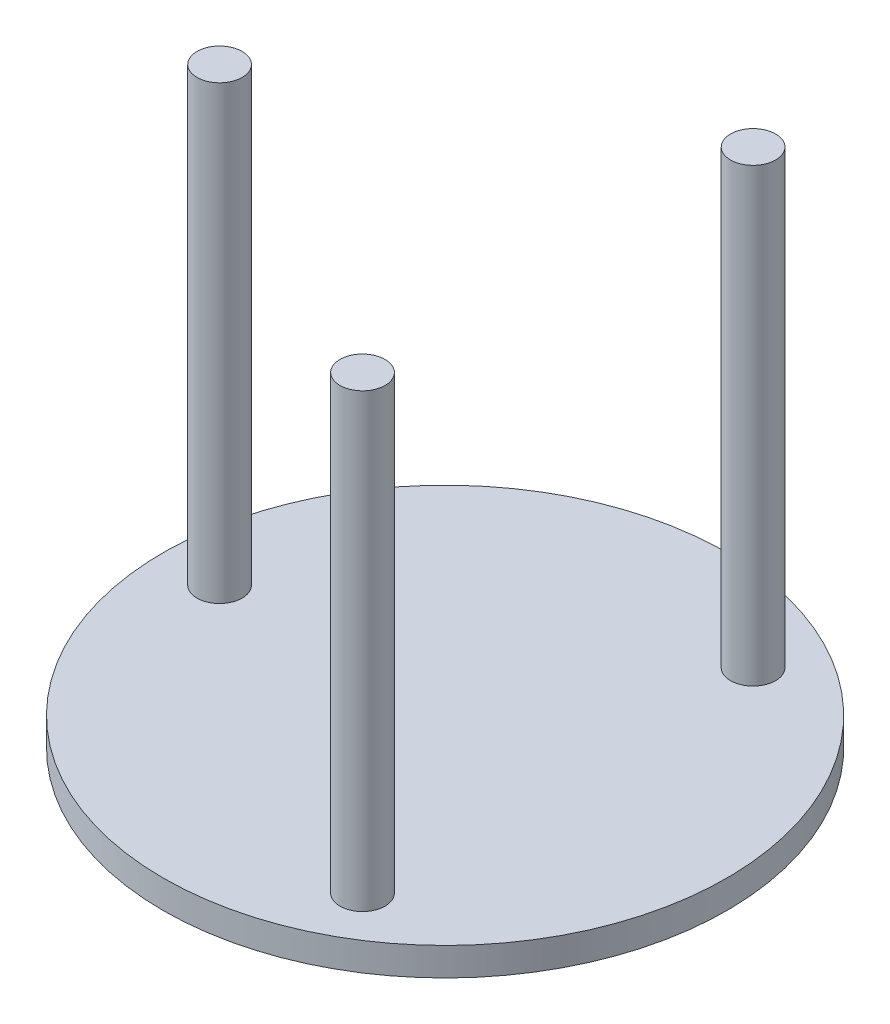
ISO-10303-21;
HEADER;
FILE_DESCRIPTION(('STEP AP214'),'2;1');
FILE_NAME('part.step','',(''),(''),'','','');
FILE_SCHEMA(('AUTOMOTIVE_DESIGN { 1 0 10303 214 1 1 1 1 }'));
ENDSEC;
DATA;
#1=APPLICATION_CONTEXT('core data for automotive mechanical design processes');
#2=APPLICATION_PROTOCOL_DEFINITION('international standard','automotive_design',2000,#1);
#3=PRODUCT_CONTEXT('',#1,'mechanical');
#4=PRODUCT('Part','Part','',(#3));
#5=PRODUCT_RELATED_PRODUCT_CATEGORY('part','',(#4));
#6=PRODUCT_DEFINITION_FORMATION('','',#4);
#7=PRODUCT_DEFINITION_CONTEXT('part definition',#1,'design');
#8=PRODUCT_DEFINITION('design','',#6,#7);
#9=PRODUCT_DEFINITION_SHAPE('','',#8);
#10=(LENGTH_UNIT() NAMED_UNIT(*) SI_UNIT(.MILLI.,.METRE.));
#11=(NAMED_UNIT(*) PLANE_ANGLE_UNIT() SI_UNIT($,.RADIAN.));
#12=(NAMED_UNIT(*) SI_UNIT($,.STERADIAN.) SOLID_ANGLE_UNIT());
#13=UNCERTAINTY_MEASURE_WITH_UNIT(LENGTH_MEASURE(1.E-05),#10,'distance_accuracy_value','');
#14=(GEOMETRIC_REPRESENTATION_CONTEXT(3) GLOBAL_UNCERTAINTY_ASSIGNED_CONTEXT((#13)) GLOBAL_UNIT_ASSIGNED_CONTEXT((#10,
#11,#12)) REPRESENTATION_CONTEXT('',''));
#15=CARTESIAN_POINT('',(0.,0.,0.));
#16=DIRECTION('',(0.,0.,1.));
#17=DIRECTION('',(1.,0.,0.));
#18=AXIS2_PLACEMENT_3D('',#15,#16,#17);
#19=CARTESIAN_POINT('',(0.,5.,0.));
#20=DIRECTION('',(0.,-1.,0.));
#21=DIRECTION('',(0.,0.,-1.));
#22=AXIS2_PLACEMENT_3D('',#19,#20,#21);
#23=CYLINDRICAL_SURFACE('',#22,50.);
#24=CARTESIAN_POINT('',(0.,5.,0.));
#25=DIRECTION('',(0.,1.,0.));
#26=DIRECTION('',(0.,0.,1.));
#27=AXIS2_PLACEMENT_3D('',#24,#25,#26);
#28=CIRCLE('',#27,50.);
#29=CARTESIAN_POINT('',(0.,5.,50.));
#30=VERTEX_POINT('',#29);
#31=EDGE_CURVE('E10',#30,#30,#28,.T.);
#32=ORIENTED_EDGE('',*,*,#31,.F.);
#33=EDGE_LOOP('',(#32));
#34=FACE_BOUND('',#33,.T.);
#35=CARTESIAN_POINT('',(0.,0.,0.));
#36=DIRECTION('',(0.,1.,0.));
#37=DIRECTION('',(0.,0.,1.));
#38=AXIS2_PLACEMENT_3D('',#35,#36,#37);
#39=CIRCLE('',#38,50.);
#40=CARTESIAN_POINT('',(0.,0.,50.));
#41=VERTEX_POINT('',#40);
#42=EDGE_CURVE('E40',#41,#41,#39,.T.);
#43=ORIENTED_EDGE('',*,*,#42,.T.);
#44=EDGE_LOOP('',(#43));
#45=FACE_BOUND('',#44,.T.);
#46=ADVANCED_FACE('F37',(#34,#45),#23,.T.);
#47=CARTESIAN_POINT('',(0.,5.,0.));
#48=DIRECTION('',(0.,1.,0.));
#49=DIRECTION('',(0.,0.,1.));
#50=AXIS2_PLACEMENT_3D('',#47,#48,#49);
#51=PLANE('',#50);
#52=CARTESIAN_POINT('',(19.9999999999997,5.,34.6410161513777));
#53=DIRECTION('',(0.,1.,0.));
#54=DIRECTION('',(0.,0.,1.));
#55=AXIS2_PLACEMENT_3D('',#52,#53,#54);
#56=CIRCLE('',#55,4.);
#57=CARTESIAN_POINT('',(19.9999999999997,5.,38.6410161513777));
#58=VERTEX_POINT('',#57);
#59=EDGE_CURVE('E67',#58,#58,#56,.T.);
#60=ORIENTED_EDGE('',*,*,#59,.F.);
#61=EDGE_LOOP('',(#60));
#62=FACE_BOUND('',#61,.T.);
#63=CARTESIAN_POINT('',(20.0000000000007,5.,-34.6410161513772));
#64=DIRECTION('',(0.,1.,0.));
#65=DIRECTION('',(0.,0.,1.));
#66=AXIS2_PLACEMENT_3D('',#63,#64,#65);
#67=CIRCLE('',#66,4.00000000000001);
#68=CARTESIAN_POINT('',(20.0000000000007,5.,-30.6410161513772));
#69=VERTEX_POINT('',#68);
#70=EDGE_CURVE('E59',#69,#69,#67,.T.);
#71=ORIENTED_EDGE('',*,*,#70,.F.);
#72=EDGE_LOOP('',(#71));
#73=FACE_BOUND('',#72,.T.);
#74=CARTESIAN_POINT('',(-40.,5.,0.));
#75=DIRECTION('',(0.,1.,0.));
#76=DIRECTION('',(0.,0.,1.));
#77=AXIS2_PLACEMENT_3D('',#74,#75,#76);
#78=CIRCLE('',#77,4.);
#79=CARTESIAN_POINT('',(-40.,5.,4.));
#80=VERTEX_POINT('',#79);
#81=EDGE_CURVE('E51',#80,#80,#78,.T.);
#82=ORIENTED_EDGE('',*,*,#81,.F.);
#83=EDGE_LOOP('',(#82));
#84=FACE_BOUND('',#83,.T.);
#85=ORIENTED_EDGE('',*,*,#31,.T.);
#86=EDGE_LOOP('',(#85));
#87=FACE_BOUND('',#86,.T.);
#88=ADVANCED_FACE('F84',(#62,#73,#84,#87),#51,.T.);
#89=CARTESIAN_POINT('',(0.,0.,0.));
#90=DIRECTION('',(0.,1.,0.));
#91=DIRECTION('',(0.,0.,1.));
#92=AXIS2_PLACEMENT_3D('',#89,#90,#91);
#93=PLANE('',#92);
#94=ORIENTED_EDGE('',*,*,#42,.F.);
#95=EDGE_LOOP('',(#94));
#96=FACE_BOUND('',#95,.T.);
#97=ADVANCED_FACE('F87',(#96),#93,.F.);
#98=CARTESIAN_POINT('',(-40.,85.,0.));
#99=DIRECTION('',(0.,-1.,0.));
#100=DIRECTION('',(0.,0.,-1.));
#101=AXIS2_PLACEMENT_3D('',#98,#99,#100);
#102=CYLINDRICAL_SURFACE('',#101,4.);
#103=CARTESIAN_POINT('',(-40.,85.,0.));
#104=DIRECTION('',(0.,1.,0.));
#105=DIRECTION('',(0.,0.,1.));
#106=AXIS2_PLACEMENT_3D('',#103,#104,#105);
#107=CIRCLE('',#106,4.);
#108=CARTESIAN_POINT('',(-40.,85.,4.));
#109=VERTEX_POINT('',#108);
#110=EDGE_CURVE('E49',#109,#109,#107,.T.);
#111=ORIENTED_EDGE('',*,*,#110,.F.);
#112=EDGE_LOOP('',(#111));
#113=FACE_BOUND('',#112,.T.);
#114=ORIENTED_EDGE('',*,*,#81,.T.);
#115=EDGE_LOOP('',(#114));
#116=FACE_BOUND('',#115,.T.);
#117=ADVANCED_FACE('F93',(#113,#116),#102,.T.);
#118=CARTESIAN_POINT('',(-40.,85.,0.));
#119=DIRECTION('',(0.,1.,0.));
#120=DIRECTION('',(0.,0.,1.));
#121=AXIS2_PLACEMENT_3D('',#118,#119,#120);
#122=PLANE('',#121);
#123=ORIENTED_EDGE('',*,*,#110,.T.);
#124=EDGE_LOOP('',(#123));
#125=FACE_BOUND('',#124,.T.);
#126=ADVANCED_FACE('F95',(#125),#122,.T.);
#127=CARTESIAN_POINT('',(20.0000000000007,85.,-34.6410161513772));
#128=DIRECTION('',(0.,-1.,0.));
#129=DIRECTION('',(0.,0.,-1.));
#130=AXIS2_PLACEMENT_3D('',#127,#128,#129);
#131=CYLINDRICAL_SURFACE('',#130,4.00000000000001);
#132=CARTESIAN_POINT('',(20.0000000000007,85.,-34.6410161513772));
#133=DIRECTION('',(0.,1.,0.));
#134=DIRECTION('',(0.,0.,1.));
#135=AXIS2_PLACEMENT_3D('',#132,#133,#134);
#136=CIRCLE('',#135,4.00000000000001);
#137=CARTESIAN_POINT('',(20.0000000000007,85.,-30.6410161513772));
#138=VERTEX_POINT('',#137);
#139=EDGE_CURVE('E55',#138,#138,#136,.T.);
#140=ORIENTED_EDGE('',*,*,#139,.F.);
#141=EDGE_LOOP('',(#140));
#142=FACE_BOUND('',#141,.T.);
#143=ORIENTED_EDGE('',*,*,#70,.T.);
#144=EDGE_LOOP('',(#143));
#145=FACE_BOUND('',#144,.T.);
#146=ADVANCED_FACE('F102',(#142,#145),#131,.T.);
#147=CARTESIAN_POINT('',(20.0000000000007,85.,-34.6410161513772));
#148=DIRECTION('',(0.,1.,0.));
#149=DIRECTION('',(0.,0.,1.));
#150=AXIS2_PLACEMENT_3D('',#147,#148,#149);
#151=PLANE('',#150);
#152=ORIENTED_EDGE('',*,*,#139,.T.);
#153=EDGE_LOOP('',(#152));
#154=FACE_BOUND('',#153,.T.);
#155=ADVANCED_FACE('F80',(#154),#151,.T.);
#156=CARTESIAN_POINT('',(19.9999999999997,85.,34.6410161513777));
#157=DIRECTION('',(0.,-1.,0.));
#158=DIRECTION('',(0.,0.,-1.));
#159=AXIS2_PLACEMENT_3D('',#156,#157,#158);
#160=CYLINDRICAL_SURFACE('',#159,4.);
#161=CARTESIAN_POINT('',(19.9999999999997,85.,34.6410161513777));
#162=DIRECTION('',(0.,1.,0.));
#163=DIRECTION('',(0.,0.,1.));
#164=AXIS2_PLACEMENT_3D('',#161,#162,#163);
#165=CIRCLE('',#164,4.);
#166=CARTESIAN_POINT('',(19.9999999999997,85.,38.6410161513777));
#167=VERTEX_POINT('',#166);
#168=EDGE_CURVE('E63',#167,#167,#165,.T.);
#169=ORIENTED_EDGE('',*,*,#168,.F.);
#170=EDGE_LOOP('',(#169));
#171=FACE_BOUND('',#170,.T.);
#172=ORIENTED_EDGE('',*,*,#59,.T.);
#173=EDGE_LOOP('',(#172));
#174=FACE_BOUND('',#173,.T.);
#175=ADVANCED_FACE('F77',(#171,#174),#160,.T.);
#176=CARTESIAN_POINT('',(19.9999999999997,85.,34.6410161513777));
#177=DIRECTION('',(0.,1.,0.));
#178=DIRECTION('',(0.,0.,1.));
#179=AXIS2_PLACEMENT_3D('',#176,#177,#178);
#180=PLANE('',#179);
#181=ORIENTED_EDGE('',*,*,#168,.T.);
#182=EDGE_LOOP('',(#181));
#183=FACE_BOUND('',#182,.T.);
#184=ADVANCED_FACE('F75',(#183),#180,.T.);
#185=CLOSED_SHELL('',(#46,#88,#97,#117,#126,#146,#155,#175,#184));
#186=MANIFOLD_SOLID_BREP('B2',#185);
#187=ADVANCED_BREP_SHAPE_REPRESENTATION('',(#18,#186),#14);
#188=SHAPE_DEFINITION_REPRESENTATION(#9,#187);
ENDSEC;
END-ISO-10303-21;
